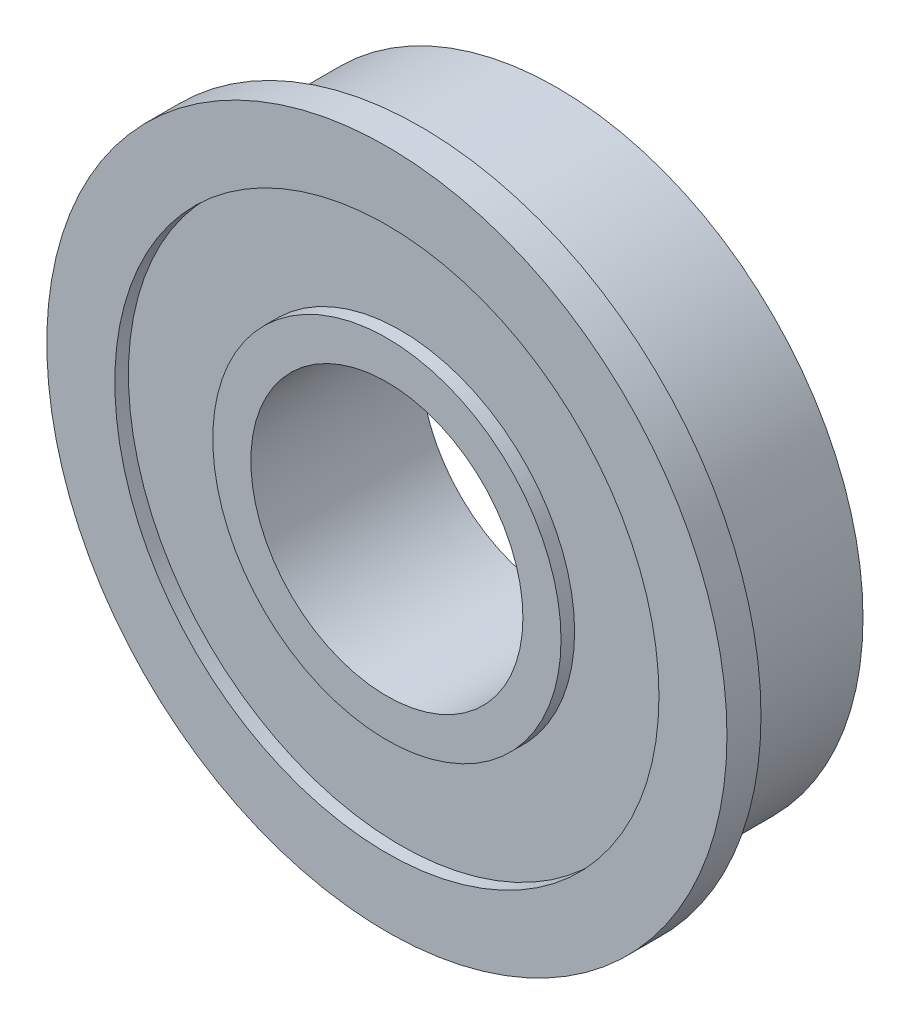
ISO-10303-21;
HEADER;
FILE_DESCRIPTION(('STEP AP214'),'2;1');
FILE_NAME('part.step','',(''),(''),'','','');
FILE_SCHEMA(('AUTOMOTIVE_DESIGN { 1 0 10303 214 1 1 1 1 }'));
ENDSEC;
DATA;
#1=APPLICATION_CONTEXT('core data for automotive mechanical design processes');
#2=APPLICATION_PROTOCOL_DEFINITION('international standard','automotive_design',2000,#1);
#3=PRODUCT_CONTEXT('',#1,'mechanical');
#4=PRODUCT('Part','Part','',(#3));
#5=PRODUCT_RELATED_PRODUCT_CATEGORY('part','',(#4));
#6=PRODUCT_DEFINITION_FORMATION('','',#4);
#7=PRODUCT_DEFINITION_CONTEXT('part definition',#1,'design');
#8=PRODUCT_DEFINITION('design','',#6,#7);
#9=PRODUCT_DEFINITION_SHAPE('','',#8);
#10=(LENGTH_UNIT() NAMED_UNIT(*) SI_UNIT(.MILLI.,.METRE.));
#11=(NAMED_UNIT(*) PLANE_ANGLE_UNIT() SI_UNIT($,.RADIAN.));
#12=(NAMED_UNIT(*) SI_UNIT($,.STERADIAN.) SOLID_ANGLE_UNIT());
#13=UNCERTAINTY_MEASURE_WITH_UNIT(LENGTH_MEASURE(1.E-05),#10,'distance_accuracy_value','');
#14=(GEOMETRIC_REPRESENTATION_CONTEXT(3) GLOBAL_UNCERTAINTY_ASSIGNED_CONTEXT((#13)) GLOBAL_UNIT_ASSIGNED_CONTEXT((#10,
#11,#12)) REPRESENTATION_CONTEXT('',''));
#15=CARTESIAN_POINT('',(0.,0.,0.));
#16=DIRECTION('',(0.,0.,1.));
#17=DIRECTION('',(1.,0.,0.));
#18=AXIS2_PLACEMENT_3D('',#15,#16,#17);
#19=CARTESIAN_POINT('',(0.,0.,-3.96875));
#20=DIRECTION('',(0.,0.,1.));
#21=DIRECTION('',(1.,0.,0.));
#22=AXIS2_PLACEMENT_3D('',#19,#20,#21);
#23=CYLINDRICAL_SURFACE('',#22,6.35);
#24=CARTESIAN_POINT('',(0.,0.,3.96875));
#25=DIRECTION('',(0.,0.,1.));
#26=DIRECTION('',(1.,0.,0.));
#27=AXIS2_PLACEMENT_3D('',#24,#25,#26);
#28=CIRCLE('',#27,6.35);
#29=CARTESIAN_POINT('',(6.35,0.,3.96875));
#30=VERTEX_POINT('',#29);
#31=EDGE_CURVE('E10',#30,#30,#28,.T.);
#32=ORIENTED_EDGE('',*,*,#31,.T.);
#33=EDGE_LOOP('',(#32));
#34=FACE_BOUND('',#33,.T.);
#35=CARTESIAN_POINT('',(0.,0.,-3.96875));
#36=DIRECTION('',(0.,0.,1.));
#37=DIRECTION('',(1.,0.,0.));
#38=AXIS2_PLACEMENT_3D('',#35,#36,#37);
#39=CIRCLE('',#38,6.35);
#40=CARTESIAN_POINT('',(6.35,0.,-3.96875));
#41=VERTEX_POINT('',#40);
#42=EDGE_CURVE('E74',#41,#41,#39,.T.);
#43=ORIENTED_EDGE('',*,*,#42,.F.);
#44=EDGE_LOOP('',(#43));
#45=FACE_BOUND('',#44,.T.);
#46=ADVANCED_FACE('F28',(#34,#45),#23,.F.);
#47=CARTESIAN_POINT('',(6.35,0.,3.96875));
#48=DIRECTION('',(0.,0.,1.));
#49=DIRECTION('',(1.,0.,0.));
#50=AXIS2_PLACEMENT_3D('',#47,#48,#49);
#51=PLANE('',#50);
#52=CARTESIAN_POINT('',(0.,0.,3.96875));
#53=DIRECTION('',(0.,0.,1.));
#54=DIRECTION('',(1.,0.,0.));
#55=AXIS2_PLACEMENT_3D('',#52,#53,#54);
#56=CIRCLE('',#55,8.128);
#57=CARTESIAN_POINT('',(8.128,0.,3.96875));
#58=VERTEX_POINT('',#57);
#59=EDGE_CURVE('E34',#58,#58,#56,.T.);
#60=ORIENTED_EDGE('',*,*,#59,.T.);
#61=EDGE_LOOP('',(#60));
#62=FACE_BOUND('',#61,.T.);
#63=ORIENTED_EDGE('',*,*,#31,.F.);
#64=EDGE_LOOP('',(#63));
#65=FACE_BOUND('',#64,.T.);
#66=ADVANCED_FACE('F82',(#62,#65),#51,.T.);
#67=CARTESIAN_POINT('',(0.,0.,-3.96875));
#68=DIRECTION('',(0.,0.,1.));
#69=DIRECTION('',(1.,0.,0.));
#70=AXIS2_PLACEMENT_3D('',#67,#68,#69);
#71=CYLINDRICAL_SURFACE('',#70,8.128);
#72=CARTESIAN_POINT('',(0.,0.,3.33375));
#73=DIRECTION('',(0.,0.,1.));
#74=DIRECTION('',(1.,0.,0.));
#75=AXIS2_PLACEMENT_3D('',#72,#73,#74);
#76=CIRCLE('',#75,8.128);
#77=CARTESIAN_POINT('',(8.128,0.,3.33375));
#78=VERTEX_POINT('',#77);
#79=EDGE_CURVE('E38',#78,#78,#76,.T.);
#80=ORIENTED_EDGE('',*,*,#79,.T.);
#81=EDGE_LOOP('',(#80));
#82=FACE_BOUND('',#81,.T.);
#83=ORIENTED_EDGE('',*,*,#59,.F.);
#84=EDGE_LOOP('',(#83));
#85=FACE_BOUND('',#84,.T.);
#86=ADVANCED_FACE('F86',(#82,#85),#71,.T.);
#87=CARTESIAN_POINT('',(8.128,0.,3.33375));
#88=DIRECTION('',(0.,0.,1.));
#89=DIRECTION('',(1.,0.,0.));
#90=AXIS2_PLACEMENT_3D('',#87,#88,#89);
#91=PLANE('',#90);
#92=CARTESIAN_POINT('',(0.,0.,3.33375));
#93=DIRECTION('',(0.,0.,1.));
#94=DIRECTION('',(1.,0.,0.));
#95=AXIS2_PLACEMENT_3D('',#92,#93,#94);
#96=CIRCLE('',#95,12.7);
#97=CARTESIAN_POINT('',(12.7,0.,3.33375));
#98=VERTEX_POINT('',#97);
#99=EDGE_CURVE('E42',#98,#98,#96,.T.);
#100=ORIENTED_EDGE('',*,*,#99,.T.);
#101=EDGE_LOOP('',(#100));
#102=FACE_BOUND('',#101,.T.);
#103=ORIENTED_EDGE('',*,*,#79,.F.);
#104=EDGE_LOOP('',(#103));
#105=FACE_BOUND('',#104,.T.);
#106=ADVANCED_FACE('F90',(#102,#105),#91,.T.);
#107=CARTESIAN_POINT('',(0.,0.,-3.96875));
#108=DIRECTION('',(0.,0.,1.));
#109=DIRECTION('',(1.,0.,0.));
#110=AXIS2_PLACEMENT_3D('',#107,#108,#109);
#111=CYLINDRICAL_SURFACE('',#110,12.7);
#112=CARTESIAN_POINT('',(0.,0.,3.96875));
#113=DIRECTION('',(0.,0.,1.));
#114=DIRECTION('',(1.,0.,0.));
#115=AXIS2_PLACEMENT_3D('',#112,#113,#114);
#116=CIRCLE('',#115,12.7);
#117=CARTESIAN_POINT('',(12.7,0.,3.96875));
#118=VERTEX_POINT('',#117);
#119=EDGE_CURVE('E47',#118,#118,#116,.T.);
#120=ORIENTED_EDGE('',*,*,#119,.T.);
#121=EDGE_LOOP('',(#120));
#122=FACE_BOUND('',#121,.T.);
#123=ORIENTED_EDGE('',*,*,#99,.F.);
#124=EDGE_LOOP('',(#123));
#125=FACE_BOUND('',#124,.T.);
#126=ADVANCED_FACE('F97',(#122,#125),#111,.F.);
#127=CARTESIAN_POINT('',(12.7,0.,3.96875));
#128=DIRECTION('',(0.,0.,1.));
#129=DIRECTION('',(1.,0.,0.));
#130=AXIS2_PLACEMENT_3D('',#127,#128,#129);
#131=PLANE('',#130);
#132=CARTESIAN_POINT('',(0.,0.,3.96875));
#133=DIRECTION('',(0.,0.,1.));
#134=DIRECTION('',(1.,0.,0.));
#135=AXIS2_PLACEMENT_3D('',#132,#133,#134);
#136=CIRCLE('',#135,15.875);
#137=CARTESIAN_POINT('',(15.875,0.,3.96875));
#138=VERTEX_POINT('',#137);
#139=EDGE_CURVE('E50',#138,#138,#136,.T.);
#140=ORIENTED_EDGE('',*,*,#139,.T.);
#141=EDGE_LOOP('',(#140));
#142=FACE_BOUND('',#141,.T.);
#143=ORIENTED_EDGE('',*,*,#119,.F.);
#144=EDGE_LOOP('',(#143));
#145=FACE_BOUND('',#144,.T.);
#146=ADVANCED_FACE('F101',(#142,#145),#131,.T.);
#147=CARTESIAN_POINT('',(0.,0.,-3.96875));
#148=DIRECTION('',(0.,0.,1.));
#149=DIRECTION('',(1.,0.,0.));
#150=AXIS2_PLACEMENT_3D('',#147,#148,#149);
#151=CYLINDRICAL_SURFACE('',#150,15.875);
#152=CARTESIAN_POINT('',(0.,0.,2.38125));
#153=DIRECTION('',(0.,0.,1.));
#154=DIRECTION('',(1.,0.,0.));
#155=AXIS2_PLACEMENT_3D('',#152,#153,#154);
#156=CIRCLE('',#155,15.875);
#157=CARTESIAN_POINT('',(15.875,0.,2.38125));
#158=VERTEX_POINT('',#157);
#159=EDGE_CURVE('E53',#158,#158,#156,.T.);
#160=ORIENTED_EDGE('',*,*,#159,.T.);
#161=EDGE_LOOP('',(#160));
#162=FACE_BOUND('',#161,.T.);
#163=ORIENTED_EDGE('',*,*,#139,.F.);
#164=EDGE_LOOP('',(#163));
#165=FACE_BOUND('',#164,.T.);
#166=ADVANCED_FACE('F105',(#162,#165),#151,.T.);
#167=CARTESIAN_POINT('',(15.875,0.,2.38125));
#168=DIRECTION('',(0.,0.,-1.));
#169=DIRECTION('',(-1.,0.,0.));
#170=AXIS2_PLACEMENT_3D('',#167,#168,#169);
#171=PLANE('',#170);
#172=CARTESIAN_POINT('',(0.,0.,2.38125));
#173=DIRECTION('',(0.,0.,1.));
#174=DIRECTION('',(1.,0.,0.));
#175=AXIS2_PLACEMENT_3D('',#172,#173,#174);
#176=CIRCLE('',#175,14.2875);
#177=CARTESIAN_POINT('',(14.2875,0.,2.38125));
#178=VERTEX_POINT('',#177);
#179=EDGE_CURVE('E56',#178,#178,#176,.T.);
#180=ORIENTED_EDGE('',*,*,#179,.T.);
#181=EDGE_LOOP('',(#180));
#182=FACE_BOUND('',#181,.T.);
#183=ORIENTED_EDGE('',*,*,#159,.F.);
#184=EDGE_LOOP('',(#183));
#185=FACE_BOUND('',#184,.T.);
#186=ADVANCED_FACE('F109',(#182,#185),#171,.T.);
#187=CARTESIAN_POINT('',(0.,0.,-3.96875));
#188=DIRECTION('',(0.,0.,1.));
#189=DIRECTION('',(1.,0.,0.));
#190=AXIS2_PLACEMENT_3D('',#187,#188,#189);
#191=CYLINDRICAL_SURFACE('',#190,14.2875);
#192=CARTESIAN_POINT('',(0.,0.,-3.96875));
#193=DIRECTION('',(0.,0.,1.));
#194=DIRECTION('',(1.,0.,0.));
#195=AXIS2_PLACEMENT_3D('',#192,#193,#194);
#196=CIRCLE('',#195,14.2875);
#197=CARTESIAN_POINT('',(14.2875,0.,-3.96875));
#198=VERTEX_POINT('',#197);
#199=EDGE_CURVE('E59',#198,#198,#196,.T.);
#200=ORIENTED_EDGE('',*,*,#199,.T.);
#201=EDGE_LOOP('',(#200));
#202=FACE_BOUND('',#201,.T.);
#203=ORIENTED_EDGE('',*,*,#179,.F.);
#204=EDGE_LOOP('',(#203));
#205=FACE_BOUND('',#204,.T.);
#206=ADVANCED_FACE('F113',(#202,#205),#191,.T.);
#207=CARTESIAN_POINT('',(14.2875,0.,-3.96875));
#208=DIRECTION('',(0.,0.,-1.));
#209=DIRECTION('',(-1.,0.,0.));
#210=AXIS2_PLACEMENT_3D('',#207,#208,#209);
#211=PLANE('',#210);
#212=CARTESIAN_POINT('',(0.,0.,-3.96875));
#213=DIRECTION('',(0.,0.,1.));
#214=DIRECTION('',(1.,0.,0.));
#215=AXIS2_PLACEMENT_3D('',#212,#213,#214);
#216=CIRCLE('',#215,12.7);
#217=CARTESIAN_POINT('',(12.7,0.,-3.96875));
#218=VERTEX_POINT('',#217);
#219=EDGE_CURVE('E62',#218,#218,#216,.T.);
#220=ORIENTED_EDGE('',*,*,#219,.T.);
#221=EDGE_LOOP('',(#220));
#222=FACE_BOUND('',#221,.T.);
#223=ORIENTED_EDGE('',*,*,#199,.F.);
#224=EDGE_LOOP('',(#223));
#225=FACE_BOUND('',#224,.T.);
#226=ADVANCED_FACE('F117',(#222,#225),#211,.T.);
#227=CARTESIAN_POINT('',(0.,0.,-3.96875));
#228=DIRECTION('',(0.,0.,1.));
#229=DIRECTION('',(1.,0.,0.));
#230=AXIS2_PLACEMENT_3D('',#227,#228,#229);
#231=CYLINDRICAL_SURFACE('',#230,12.7);
#232=CARTESIAN_POINT('',(0.,0.,-3.33375));
#233=DIRECTION('',(0.,0.,1.));
#234=DIRECTION('',(1.,0.,0.));
#235=AXIS2_PLACEMENT_3D('',#232,#233,#234);
#236=CIRCLE('',#235,12.7);
#237=CARTESIAN_POINT('',(12.7,0.,-3.33375));
#238=VERTEX_POINT('',#237);
#239=EDGE_CURVE('E65',#238,#238,#236,.T.);
#240=ORIENTED_EDGE('',*,*,#239,.T.);
#241=EDGE_LOOP('',(#240));
#242=FACE_BOUND('',#241,.T.);
#243=ORIENTED_EDGE('',*,*,#219,.F.);
#244=EDGE_LOOP('',(#243));
#245=FACE_BOUND('',#244,.T.);
#246=ADVANCED_FACE('F121',(#242,#245),#231,.F.);
#247=CARTESIAN_POINT('',(12.7,0.,-3.33375));
#248=DIRECTION('',(0.,0.,-1.));
#249=DIRECTION('',(-1.,0.,0.));
#250=AXIS2_PLACEMENT_3D('',#247,#248,#249);
#251=PLANE('',#250);
#252=CARTESIAN_POINT('',(0.,0.,-3.33375));
#253=DIRECTION('',(0.,0.,1.));
#254=DIRECTION('',(1.,0.,0.));
#255=AXIS2_PLACEMENT_3D('',#252,#253,#254);
#256=CIRCLE('',#255,8.128);
#257=CARTESIAN_POINT('',(8.128,0.,-3.33375));
#258=VERTEX_POINT('',#257);
#259=EDGE_CURVE('E68',#258,#258,#256,.T.);
#260=ORIENTED_EDGE('',*,*,#259,.T.);
#261=EDGE_LOOP('',(#260));
#262=FACE_BOUND('',#261,.T.);
#263=ORIENTED_EDGE('',*,*,#239,.F.);
#264=EDGE_LOOP('',(#263));
#265=FACE_BOUND('',#264,.T.);
#266=ADVANCED_FACE('F125',(#262,#265),#251,.T.);
#267=CARTESIAN_POINT('',(0.,0.,-3.96875));
#268=DIRECTION('',(0.,0.,1.));
#269=DIRECTION('',(1.,0.,0.));
#270=AXIS2_PLACEMENT_3D('',#267,#268,#269);
#271=CYLINDRICAL_SURFACE('',#270,8.128);
#272=CARTESIAN_POINT('',(0.,0.,-3.96875));
#273=DIRECTION('',(0.,0.,1.));
#274=DIRECTION('',(1.,0.,0.));
#275=AXIS2_PLACEMENT_3D('',#272,#273,#274);
#276=CIRCLE('',#275,8.128);
#277=CARTESIAN_POINT('',(8.128,0.,-3.96875));
#278=VERTEX_POINT('',#277);
#279=EDGE_CURVE('E71',#278,#278,#276,.T.);
#280=ORIENTED_EDGE('',*,*,#279,.T.);
#281=EDGE_LOOP('',(#280));
#282=FACE_BOUND('',#281,.T.);
#283=ORIENTED_EDGE('',*,*,#259,.F.);
#284=EDGE_LOOP('',(#283));
#285=FACE_BOUND('',#284,.T.);
#286=ADVANCED_FACE('F129',(#282,#285),#271,.T.);
#287=CARTESIAN_POINT('',(8.128,0.,-3.96875));
#288=DIRECTION('',(0.,0.,-1.));
#289=DIRECTION('',(-1.,0.,0.));
#290=AXIS2_PLACEMENT_3D('',#287,#288,#289);
#291=PLANE('',#290);
#292=ORIENTED_EDGE('',*,*,#42,.T.);
#293=EDGE_LOOP('',(#292));
#294=FACE_BOUND('',#293,.T.);
#295=ORIENTED_EDGE('',*,*,#279,.F.);
#296=EDGE_LOOP('',(#295));
#297=FACE_BOUND('',#296,.T.);
#298=ADVANCED_FACE('F78',(#294,#297),#291,.T.);
#299=CLOSED_SHELL('',(#46,#66,#86,#106,#126,#146,#166,#186,#206,#226,#246,#266,#286,#298));
#300=MANIFOLD_SOLID_BREP('B2',#299);
#301=ADVANCED_BREP_SHAPE_REPRESENTATION('',(#18,#300),#14);
#302=SHAPE_DEFINITION_REPRESENTATION(#9,#301);
ENDSEC;
END-ISO-10303-21;
